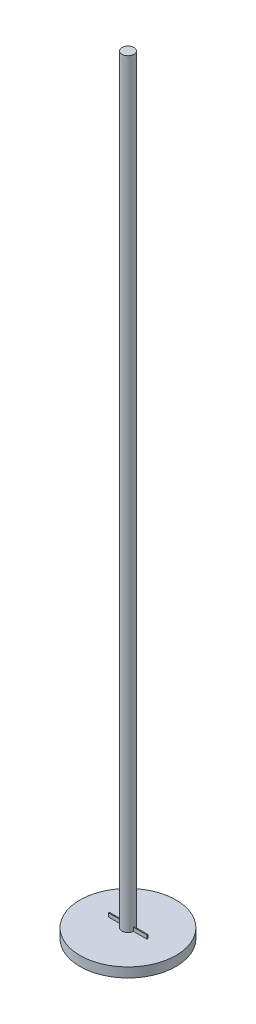
ISO-10303-21;
HEADER;
FILE_DESCRIPTION(('STEP AP214'),'2;1');
FILE_NAME('part.step','',(''),(''),'','','');
FILE_SCHEMA(('AUTOMOTIVE_DESIGN { 1 0 10303 214 1 1 1 1 }'));
ENDSEC;
DATA;
#1=APPLICATION_CONTEXT('core data for automotive mechanical design processes');
#2=APPLICATION_PROTOCOL_DEFINITION('international standard','automotive_design',2000,#1);
#3=PRODUCT_CONTEXT('',#1,'mechanical');
#4=PRODUCT('Part','Part','',(#3));
#5=PRODUCT_RELATED_PRODUCT_CATEGORY('part','',(#4));
#6=PRODUCT_DEFINITION_FORMATION('','',#4);
#7=PRODUCT_DEFINITION_CONTEXT('part definition',#1,'design');
#8=PRODUCT_DEFINITION('design','',#6,#7);
#9=PRODUCT_DEFINITION_SHAPE('','',#8);
#10=(LENGTH_UNIT() NAMED_UNIT(*) SI_UNIT(.MILLI.,.METRE.));
#11=(NAMED_UNIT(*) PLANE_ANGLE_UNIT() SI_UNIT($,.RADIAN.));
#12=(NAMED_UNIT(*) SI_UNIT($,.STERADIAN.) SOLID_ANGLE_UNIT());
#13=UNCERTAINTY_MEASURE_WITH_UNIT(LENGTH_MEASURE(1.E-05),#10,'distance_accuracy_value','');
#14=(GEOMETRIC_REPRESENTATION_CONTEXT(3) GLOBAL_UNCERTAINTY_ASSIGNED_CONTEXT((#13)) GLOBAL_UNIT_ASSIGNED_CONTEXT((#10,
#11,#12)) REPRESENTATION_CONTEXT('',''));
#15=CARTESIAN_POINT('',(0.,0.,0.));
#16=DIRECTION('',(0.,0.,1.));
#17=DIRECTION('',(1.,0.,0.));
#18=AXIS2_PLACEMENT_3D('',#15,#16,#17);
#19=CARTESIAN_POINT('',(0.,1.,0.));
#20=DIRECTION('',(0.,-1.,0.));
#21=DIRECTION('',(0.,0.,-1.));
#22=AXIS2_PLACEMENT_3D('',#19,#20,#21);
#23=CYLINDRICAL_SURFACE('',#22,5.);
#24=CARTESIAN_POINT('',(0.,1.,0.));
#25=DIRECTION('',(0.,1.,0.));
#26=DIRECTION('',(0.,0.,1.));
#27=AXIS2_PLACEMENT_3D('',#24,#25,#26);
#28=CIRCLE('',#27,5.);
#29=CARTESIAN_POINT('',(0.,1.,5.));
#30=VERTEX_POINT('',#29);
#31=EDGE_CURVE('E147',#30,#30,#28,.T.);
#32=ORIENTED_EDGE('',*,*,#31,.F.);
#33=EDGE_LOOP('',(#32));
#34=FACE_BOUND('',#33,.T.);
#35=CARTESIAN_POINT('',(0.,0.,0.));
#36=DIRECTION('',(0.,1.,0.));
#37=DIRECTION('',(0.,0.,1.));
#38=AXIS2_PLACEMENT_3D('',#35,#36,#37);
#39=CIRCLE('',#38,5.);
#40=CARTESIAN_POINT('',(0.,0.,5.));
#41=VERTEX_POINT('',#40);
#42=EDGE_CURVE('E151',#41,#41,#39,.T.);
#43=ORIENTED_EDGE('',*,*,#42,.T.);
#44=EDGE_LOOP('',(#43));
#45=FACE_BOUND('',#44,.T.);
#46=ADVANCED_FACE('F39',(#34,#45),#23,.T.);
#47=CARTESIAN_POINT('',(0.,1.,0.));
#48=DIRECTION('',(0.,1.,0.));
#49=DIRECTION('',(0.,0.,1.));
#50=AXIS2_PLACEMENT_3D('',#47,#48,#49);
#51=PLANE('',#50);
#52=DIRECTION('',(1.,0.,0.));
#53=VECTOR('',#52,1.);
#54=CARTESIAN_POINT('',(0.,1.,0.05));
#55=LINE('',#54,#53);
#56=CARTESIAN_POINT('',(-1.9808419018076,1.,0.05));
#57=VERTEX_POINT('',#56);
#58=CARTESIAN_POINT('',(-0.620508539064895,1.,0.05));
#59=VERTEX_POINT('',#58);
#60=EDGE_CURVE('E53',#57,#59,#55,.T.);
#61=ORIENTED_EDGE('',*,*,#60,.F.);
#62=DIRECTION('',(0.,0.,-1.));
#63=VECTOR('',#62,1.);
#64=CARTESIAN_POINT('',(-1.9808419018076,1.,0.));
#65=LINE('',#64,#63);
#66=CARTESIAN_POINT('',(-1.9808419018076,1.,-0.05));
#67=VERTEX_POINT('',#66);
#68=EDGE_CURVE('E57',#57,#67,#65,.T.);
#69=ORIENTED_EDGE('',*,*,#68,.T.);
#70=DIRECTION('',(1.,0.,0.));
#71=VECTOR('',#70,1.);
#72=CARTESIAN_POINT('',(0.,1.,-0.05));
#73=LINE('',#72,#71);
#74=CARTESIAN_POINT('',(-0.620508539064895,1.,-0.05));
#75=VERTEX_POINT('',#74);
#76=EDGE_CURVE('E131',#67,#75,#73,.T.);
#77=ORIENTED_EDGE('',*,*,#76,.T.);
#78=CARTESIAN_POINT('',(0.,1.,0.));
#79=DIRECTION('',(0.,1.,0.));
#80=DIRECTION('',(0.,0.,1.));
#81=AXIS2_PLACEMENT_3D('',#78,#79,#80);
#82=CIRCLE('',#81,0.62251975635513);
#83=CARTESIAN_POINT('',(0.620508539064895,1.,-0.05));
#84=VERTEX_POINT('',#83);
#85=EDGE_CURVE('E146',#75,#84,#82,.F.);
#86=ORIENTED_EDGE('',*,*,#85,.T.);
#87=CARTESIAN_POINT('',(2.02076525410692,1.,-0.05));
#88=VERTEX_POINT('',#87);
#89=EDGE_CURVE('E128',#84,#88,#73,.T.);
#90=ORIENTED_EDGE('',*,*,#89,.T.);
#91=DIRECTION('',(0.,0.,1.));
#92=VECTOR('',#91,1.);
#93=CARTESIAN_POINT('',(2.02076525410692,1.,0.));
#94=LINE('',#93,#92);
#95=CARTESIAN_POINT('',(2.02076525410692,1.,0.05));
#96=VERTEX_POINT('',#95);
#97=EDGE_CURVE('E139',#88,#96,#94,.T.);
#98=ORIENTED_EDGE('',*,*,#97,.T.);
#99=CARTESIAN_POINT('',(0.620508539064895,1.,0.05));
#100=VERTEX_POINT('',#99);
#101=EDGE_CURVE('E108',#100,#96,#55,.T.);
#102=ORIENTED_EDGE('',*,*,#101,.F.);
#103=EDGE_CURVE('E144',#100,#59,#82,.F.);
#104=ORIENTED_EDGE('',*,*,#103,.T.);
#105=EDGE_LOOP('',(#61,#69,#77,#86,#90,#98,#102,#104));
#106=FACE_BOUND('',#105,.T.);
#107=ORIENTED_EDGE('',*,*,#31,.T.);
#108=EDGE_LOOP('',(#107));
#109=FACE_BOUND('',#108,.T.);
#110=ADVANCED_FACE('F186',(#106,#109),#51,.T.);
#111=CARTESIAN_POINT('',(0.,0.,0.));
#112=DIRECTION('',(0.,1.,0.));
#113=DIRECTION('',(0.,0.,1.));
#114=AXIS2_PLACEMENT_3D('',#111,#112,#113);
#115=PLANE('',#114);
#116=ORIENTED_EDGE('',*,*,#42,.F.);
#117=EDGE_LOOP('',(#116));
#118=FACE_BOUND('',#117,.T.);
#119=ADVANCED_FACE('F209',(#118),#115,.F.);
#120=CARTESIAN_POINT('',(0.,80.,0.));
#121=DIRECTION('',(0.,-1.,0.));
#122=DIRECTION('',(0.,0.,-1.));
#123=AXIS2_PLACEMENT_3D('',#120,#121,#122);
#124=CYLINDRICAL_SURFACE('',#123,0.62251975635513);
#125=CARTESIAN_POINT('',(0.,1.37579503408636,0.));
#126=DIRECTION('',(0.,-1.,0.));
#127=DIRECTION('',(0.,0.,-1.));
#128=AXIS2_PLACEMENT_3D('',#125,#126,#127);
#129=CIRCLE('',#128,0.62251975635513);
#130=CARTESIAN_POINT('',(-0.620508539064895,1.37579503408636,0.05));
#131=VERTEX_POINT('',#130);
#132=CARTESIAN_POINT('',(-0.620508539064895,1.37579503408636,-0.05));
#133=VERTEX_POINT('',#132);
#134=EDGE_CURVE('E46',#131,#133,#129,.T.);
#135=ORIENTED_EDGE('',*,*,#134,.F.);
#136=DIRECTION('',(0.,-1.,0.));
#137=VECTOR('',#136,1.);
#138=CARTESIAN_POINT('',(-0.620508539064895,80.,0.05));
#139=LINE('',#138,#137);
#140=EDGE_CURVE('E11',#131,#59,#139,.T.);
#141=ORIENTED_EDGE('',*,*,#140,.T.);
#142=ORIENTED_EDGE('',*,*,#103,.F.);
#143=DIRECTION('',(0.,-1.,0.));
#144=VECTOR('',#143,1.);
#145=CARTESIAN_POINT('',(0.620508539064895,80.,0.05));
#146=LINE('',#145,#144);
#147=CARTESIAN_POINT('',(0.620508539064895,1.37579503408636,0.05));
#148=VERTEX_POINT('',#147);
#149=EDGE_CURVE('E157',#100,#148,#146,.F.);
#150=ORIENTED_EDGE('',*,*,#149,.T.);
#151=CARTESIAN_POINT('',(0.620508539064896,1.37579503408636,-0.05));
#152=VERTEX_POINT('',#151);
#153=EDGE_CURVE('E121',#152,#148,#129,.T.);
#154=ORIENTED_EDGE('',*,*,#153,.F.);
#155=DIRECTION('',(0.,-1.,0.));
#156=VECTOR('',#155,1.);
#157=CARTESIAN_POINT('',(0.620508539064895,80.,-0.05));
#158=LINE('',#157,#156);
#159=EDGE_CURVE('E150',#84,#152,#158,.F.);
#160=ORIENTED_EDGE('',*,*,#159,.F.);
#161=ORIENTED_EDGE('',*,*,#85,.F.);
#162=DIRECTION('',(0.,-1.,0.));
#163=VECTOR('',#162,1.);
#164=CARTESIAN_POINT('',(-0.620508539064895,80.,-0.05));
#165=LINE('',#164,#163);
#166=EDGE_CURVE('E158',#133,#75,#165,.T.);
#167=ORIENTED_EDGE('',*,*,#166,.F.);
#168=EDGE_LOOP('',(#135,#141,#142,#150,#154,#160,#161,#167));
#169=FACE_BOUND('',#168,.T.);
#170=CARTESIAN_POINT('',(0.,80.,0.));
#171=DIRECTION('',(0.,1.,0.));
#172=DIRECTION('',(0.,0.,1.));
#173=AXIS2_PLACEMENT_3D('',#170,#171,#172);
#174=CIRCLE('',#173,0.62251975635513);
#175=CARTESIAN_POINT('',(0.,80.,0.62251975635513));
#176=VERTEX_POINT('',#175);
#177=EDGE_CURVE('E141',#176,#176,#174,.T.);
#178=ORIENTED_EDGE('',*,*,#177,.F.);
#179=EDGE_LOOP('',(#178));
#180=FACE_BOUND('',#179,.T.);
#181=ADVANCED_FACE('F184',(#169,#180),#124,.T.);
#182=CARTESIAN_POINT('',(0.,80.,0.));
#183=DIRECTION('',(0.,1.,0.));
#184=DIRECTION('',(0.,0.,1.));
#185=AXIS2_PLACEMENT_3D('',#182,#183,#184);
#186=PLANE('',#185);
#187=ORIENTED_EDGE('',*,*,#177,.T.);
#188=EDGE_LOOP('',(#187));
#189=FACE_BOUND('',#188,.T.);
#190=ADVANCED_FACE('F199',(#189),#186,.T.);
#191=CARTESIAN_POINT('',(0.,0.,0.05));
#192=DIRECTION('',(0.,0.,1.));
#193=DIRECTION('',(1.,0.,0.));
#194=AXIS2_PLACEMENT_3D('',#191,#192,#193);
#195=PLANE('',#194);
#196=ORIENTED_EDGE('',*,*,#149,.F.);
#197=ORIENTED_EDGE('',*,*,#101,.T.);
#198=DIRECTION('',(0.,1.,0.));
#199=VECTOR('',#198,1.);
#200=CARTESIAN_POINT('',(2.02076525410692,0.,0.05));
#201=LINE('',#200,#199);
#202=CARTESIAN_POINT('',(2.02076525410692,1.37579503408636,0.05));
#203=VERTEX_POINT('',#202);
#204=EDGE_CURVE('E103',#96,#203,#201,.T.);
#205=ORIENTED_EDGE('',*,*,#204,.T.);
#206=DIRECTION('',(-1.,0.,0.));
#207=VECTOR('',#206,1.);
#208=CARTESIAN_POINT('',(2.02076525410692,1.37579503408636,0.05));
#209=LINE('',#208,#207);
#210=EDGE_CURVE('E107',#203,#148,#209,.T.);
#211=ORIENTED_EDGE('',*,*,#210,.T.);
#212=EDGE_LOOP('',(#196,#197,#205,#211));
#213=FACE_BOUND('',#212,.T.);
#214=ADVANCED_FACE('F106',(#213),#195,.T.);
#215=CARTESIAN_POINT('',(0.,0.,-0.05));
#216=DIRECTION('',(0.,0.,1.));
#217=DIRECTION('',(1.,0.,0.));
#218=AXIS2_PLACEMENT_3D('',#215,#216,#217);
#219=PLANE('',#218);
#220=ORIENTED_EDGE('',*,*,#89,.F.);
#221=ORIENTED_EDGE('',*,*,#159,.T.);
#222=DIRECTION('',(-1.,0.,0.));
#223=VECTOR('',#222,1.);
#224=CARTESIAN_POINT('',(2.02076525410692,1.37579503408636,-0.05));
#225=LINE('',#224,#223);
#226=CARTESIAN_POINT('',(2.02076525410692,1.37579503408636,-0.05));
#227=VERTEX_POINT('',#226);
#228=EDGE_CURVE('E173',#227,#152,#225,.T.);
#229=ORIENTED_EDGE('',*,*,#228,.F.);
#230=DIRECTION('',(0.,1.,0.));
#231=VECTOR('',#230,1.);
#232=CARTESIAN_POINT('',(2.02076525410692,0.,-0.05));
#233=LINE('',#232,#231);
#234=EDGE_CURVE('E126',#88,#227,#233,.T.);
#235=ORIENTED_EDGE('',*,*,#234,.F.);
#236=EDGE_LOOP('',(#220,#221,#229,#235));
#237=FACE_BOUND('',#236,.T.);
#238=ADVANCED_FACE('F191',(#237),#219,.F.);
#239=CARTESIAN_POINT('',(2.02076525410692,1.37579503408636,0.05));
#240=DIRECTION('',(0.,-1.,0.));
#241=DIRECTION('',(0.,0.,-1.));
#242=AXIS2_PLACEMENT_3D('',#239,#240,#241);
#243=PLANE('',#242);
#244=ORIENTED_EDGE('',*,*,#228,.T.);
#245=ORIENTED_EDGE('',*,*,#153,.T.);
#246=ORIENTED_EDGE('',*,*,#210,.F.);
#247=DIRECTION('',(0.,0.,-1.));
#248=VECTOR('',#247,1.);
#249=CARTESIAN_POINT('',(2.02076525410692,1.37579503408636,0.05));
#250=LINE('',#249,#248);
#251=EDGE_CURVE('E120',#203,#227,#250,.T.);
#252=ORIENTED_EDGE('',*,*,#251,.T.);
#253=EDGE_LOOP('',(#244,#245,#246,#252));
#254=FACE_BOUND('',#253,.T.);
#255=ADVANCED_FACE('F119',(#254),#243,.F.);
#256=CARTESIAN_POINT('',(2.02076525410692,0.,0.05));
#257=DIRECTION('',(-1.,0.,0.));
#258=DIRECTION('',(0.,0.,1.));
#259=AXIS2_PLACEMENT_3D('',#256,#257,#258);
#260=PLANE('',#259);
#261=ORIENTED_EDGE('',*,*,#97,.F.);
#262=ORIENTED_EDGE('',*,*,#234,.T.);
#263=ORIENTED_EDGE('',*,*,#251,.F.);
#264=ORIENTED_EDGE('',*,*,#204,.F.);
#265=EDGE_LOOP('',(#261,#262,#263,#264));
#266=FACE_BOUND('',#265,.T.);
#267=ADVANCED_FACE('F124',(#266),#260,.F.);
#268=DIRECTION('',(0.,-1.,0.));
#269=VECTOR('',#268,1.);
#270=CARTESIAN_POINT('',(-1.9808419018076,1.37579503408636,0.05));
#271=LINE('',#270,#269);
#272=CARTESIAN_POINT('',(-1.9808419018076,1.37579503408636,0.05));
#273=VERTEX_POINT('',#272);
#274=EDGE_CURVE('E122',#273,#57,#271,.T.);
#275=ORIENTED_EDGE('',*,*,#274,.T.);
#276=ORIENTED_EDGE('',*,*,#60,.T.);
#277=ORIENTED_EDGE('',*,*,#140,.F.);
#278=EDGE_CURVE('E112',#131,#273,#209,.T.);
#279=ORIENTED_EDGE('',*,*,#278,.T.);
#280=EDGE_LOOP('',(#275,#276,#277,#279));
#281=FACE_BOUND('',#280,.T.);
#282=ADVANCED_FACE('F182',(#281),#195,.T.);
#283=ORIENTED_EDGE('',*,*,#76,.F.);
#284=DIRECTION('',(0.,-1.,0.));
#285=VECTOR('',#284,1.);
#286=CARTESIAN_POINT('',(-1.9808419018076,1.37579503408636,-0.05));
#287=LINE('',#286,#285);
#288=CARTESIAN_POINT('',(-1.9808419018076,1.37579503408636,-0.05));
#289=VERTEX_POINT('',#288);
#290=EDGE_CURVE('E113',#289,#67,#287,.T.);
#291=ORIENTED_EDGE('',*,*,#290,.F.);
#292=EDGE_CURVE('E167',#133,#289,#225,.T.);
#293=ORIENTED_EDGE('',*,*,#292,.F.);
#294=ORIENTED_EDGE('',*,*,#166,.T.);
#295=EDGE_LOOP('',(#283,#291,#293,#294));
#296=FACE_BOUND('',#295,.T.);
#297=ADVANCED_FACE('F171',(#296),#219,.F.);
#298=ORIENTED_EDGE('',*,*,#278,.F.);
#299=ORIENTED_EDGE('',*,*,#134,.T.);
#300=ORIENTED_EDGE('',*,*,#292,.T.);
#301=DIRECTION('',(0.,0.,-1.));
#302=VECTOR('',#301,1.);
#303=CARTESIAN_POINT('',(-1.9808419018076,1.37579503408636,0.05));
#304=LINE('',#303,#302);
#305=EDGE_CURVE('E129',#273,#289,#304,.T.);
#306=ORIENTED_EDGE('',*,*,#305,.F.);
#307=EDGE_LOOP('',(#298,#299,#300,#306));
#308=FACE_BOUND('',#307,.T.);
#309=ADVANCED_FACE('F165',(#308),#243,.F.);
#310=CARTESIAN_POINT('',(-1.9808419018076,1.37579503408636,0.05));
#311=DIRECTION('',(1.,0.,0.));
#312=DIRECTION('',(0.,0.,-1.));
#313=AXIS2_PLACEMENT_3D('',#310,#311,#312);
#314=PLANE('',#313);
#315=ORIENTED_EDGE('',*,*,#68,.F.);
#316=ORIENTED_EDGE('',*,*,#274,.F.);
#317=ORIENTED_EDGE('',*,*,#305,.T.);
#318=ORIENTED_EDGE('',*,*,#290,.T.);
#319=EDGE_LOOP('',(#315,#316,#317,#318));
#320=FACE_BOUND('',#319,.T.);
#321=ADVANCED_FACE('F178',(#320),#314,.F.);
#322=CLOSED_SHELL('',(#46,#110,#119,#181,#190,#214,#238,#255,#267,#282,#297,#309,#321));
#323=MANIFOLD_SOLID_BREP('B2',#322);
#324=ADVANCED_BREP_SHAPE_REPRESENTATION('',(#18,#323),#14);
#325=SHAPE_DEFINITION_REPRESENTATION(#9,#324);
ENDSEC;
END-ISO-10303-21;
